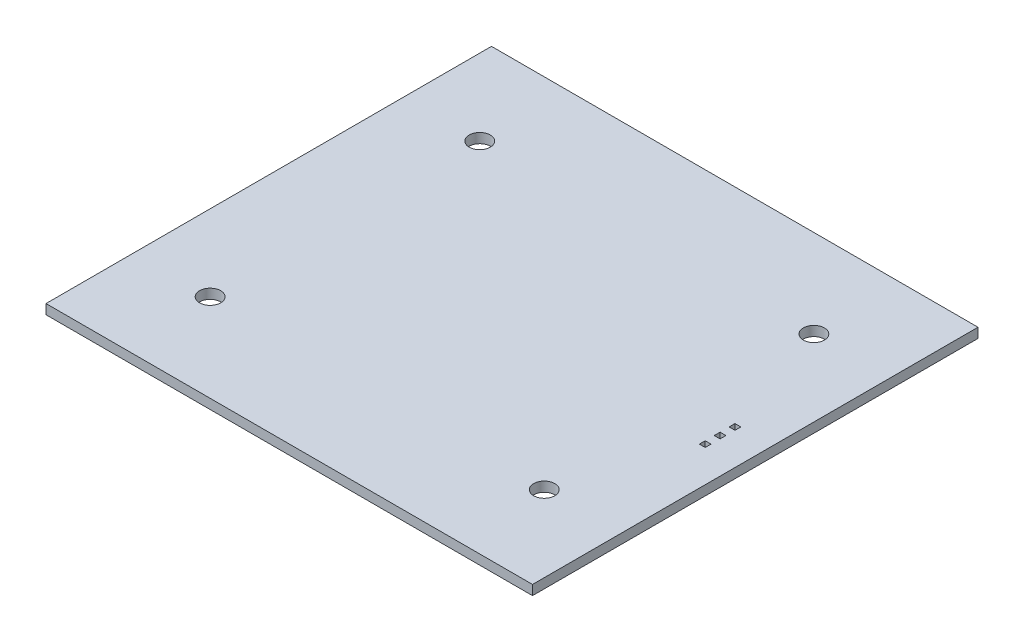
ISO-10303-21;
HEADER;
FILE_DESCRIPTION(('STEP AP214'),'2;1');
FILE_NAME('part.step','',(''),(''),'','','');
FILE_SCHEMA(('AUTOMOTIVE_DESIGN { 1 0 10303 214 1 1 1 1 }'));
ENDSEC;
DATA;
#1=APPLICATION_CONTEXT('core data for automotive mechanical design processes');
#2=APPLICATION_PROTOCOL_DEFINITION('international standard','automotive_design',2000,#1);
#3=PRODUCT_CONTEXT('',#1,'mechanical');
#4=PRODUCT('Part','Part','',(#3));
#5=PRODUCT_RELATED_PRODUCT_CATEGORY('part','',(#4));
#6=PRODUCT_DEFINITION_FORMATION('','',#4);
#7=PRODUCT_DEFINITION_CONTEXT('part definition',#1,'design');
#8=PRODUCT_DEFINITION('design','',#6,#7);
#9=PRODUCT_DEFINITION_SHAPE('','',#8);
#10=(LENGTH_UNIT() NAMED_UNIT(*) SI_UNIT(.MILLI.,.METRE.));
#11=(NAMED_UNIT(*) PLANE_ANGLE_UNIT() SI_UNIT($,.RADIAN.));
#12=(NAMED_UNIT(*) SI_UNIT($,.STERADIAN.) SOLID_ANGLE_UNIT());
#13=UNCERTAINTY_MEASURE_WITH_UNIT(LENGTH_MEASURE(1.E-05),#10,'distance_accuracy_value','');
#14=(GEOMETRIC_REPRESENTATION_CONTEXT(3) GLOBAL_UNCERTAINTY_ASSIGNED_CONTEXT((#13)) GLOBAL_UNIT_ASSIGNED_CONTEXT((#10,
#11,#12)) REPRESENTATION_CONTEXT('',''));
#15=CARTESIAN_POINT('',(0.,0.,0.));
#16=DIRECTION('',(0.,0.,1.));
#17=DIRECTION('',(1.,0.,0.));
#18=AXIS2_PLACEMENT_3D('',#15,#16,#17);
#19=CARTESIAN_POINT('',(0.,1.66,0.));
#20=DIRECTION('',(1.,0.,0.));
#21=DIRECTION('',(0.,0.,-1.));
#22=AXIS2_PLACEMENT_3D('',#19,#20,#21);
#23=PLANE('',#22);
#24=DIRECTION('',(0.,0.,1.));
#25=VECTOR('',#24,1.);
#26=CARTESIAN_POINT('',(0.,0.,0.));
#27=LINE('',#26,#25);
#28=CARTESIAN_POINT('',(0.,0.,-76.));
#29=VERTEX_POINT('',#28);
#30=CARTESIAN_POINT('',(0.,0.,0.));
#31=VERTEX_POINT('',#30);
#32=EDGE_CURVE('E241',#29,#31,#27,.T.);
#33=ORIENTED_EDGE('',*,*,#32,.T.);
#34=DIRECTION('',(0.,-1.,0.));
#35=VECTOR('',#34,1.);
#36=CARTESIAN_POINT('',(0.,1.66,0.));
#37=LINE('',#36,#35);
#38=CARTESIAN_POINT('',(0.,1.66,0.));
#39=VERTEX_POINT('',#38);
#40=EDGE_CURVE('E11',#39,#31,#37,.T.);
#41=ORIENTED_EDGE('',*,*,#40,.F.);
#42=DIRECTION('',(0.,0.,1.));
#43=VECTOR('',#42,1.);
#44=CARTESIAN_POINT('',(0.,1.66,0.));
#45=LINE('',#44,#43);
#46=CARTESIAN_POINT('',(0.,1.66,-76.));
#47=VERTEX_POINT('',#46);
#48=EDGE_CURVE('E248',#47,#39,#45,.T.);
#49=ORIENTED_EDGE('',*,*,#48,.F.);
#50=DIRECTION('',(0.,-1.,0.));
#51=VECTOR('',#50,1.);
#52=CARTESIAN_POINT('',(0.,1.66,-76.));
#53=LINE('',#52,#51);
#54=EDGE_CURVE('E258',#47,#29,#53,.T.);
#55=ORIENTED_EDGE('',*,*,#54,.T.);
#56=EDGE_LOOP('',(#33,#41,#49,#55));
#57=FACE_BOUND('',#56,.T.);
#58=ADVANCED_FACE('F32',(#57),#23,.F.);
#59=CARTESIAN_POINT('',(0.,1.66,0.));
#60=DIRECTION('',(0.,0.,-1.));
#61=DIRECTION('',(-1.,0.,0.));
#62=AXIS2_PLACEMENT_3D('',#59,#60,#61);
#63=PLANE('',#62);
#64=DIRECTION('',(1.,0.,0.));
#65=VECTOR('',#64,1.);
#66=CARTESIAN_POINT('',(0.,0.,0.));
#67=LINE('',#66,#65);
#68=CARTESIAN_POINT('',(83.,0.,0.));
#69=VERTEX_POINT('',#68);
#70=EDGE_CURVE('E261',#31,#69,#67,.T.);
#71=ORIENTED_EDGE('',*,*,#70,.T.);
#72=DIRECTION('',(0.,-1.,0.));
#73=VECTOR('',#72,1.);
#74=CARTESIAN_POINT('',(83.,1.66,0.));
#75=LINE('',#74,#73);
#76=CARTESIAN_POINT('',(83.,1.66,0.));
#77=VERTEX_POINT('',#76);
#78=EDGE_CURVE('E39',#77,#69,#75,.T.);
#79=ORIENTED_EDGE('',*,*,#78,.F.);
#80=DIRECTION('',(1.,0.,0.));
#81=VECTOR('',#80,1.);
#82=CARTESIAN_POINT('',(0.,1.66,0.));
#83=LINE('',#82,#81);
#84=EDGE_CURVE('E251',#39,#77,#83,.T.);
#85=ORIENTED_EDGE('',*,*,#84,.F.);
#86=ORIENTED_EDGE('',*,*,#40,.T.);
#87=EDGE_LOOP('',(#71,#79,#85,#86));
#88=FACE_BOUND('',#87,.T.);
#89=ADVANCED_FACE('F290',(#88),#63,.F.);
#90=CARTESIAN_POINT('',(83.,1.66,0.));
#91=DIRECTION('',(-1.,0.,0.));
#92=DIRECTION('',(0.,0.,1.));
#93=AXIS2_PLACEMENT_3D('',#90,#91,#92);
#94=PLANE('',#93);
#95=DIRECTION('',(0.,0.,-1.));
#96=VECTOR('',#95,1.);
#97=CARTESIAN_POINT('',(83.,0.,0.));
#98=LINE('',#97,#96);
#99=CARTESIAN_POINT('',(83.,0.,-76.));
#100=VERTEX_POINT('',#99);
#101=EDGE_CURVE('E263',#69,#100,#98,.T.);
#102=ORIENTED_EDGE('',*,*,#101,.T.);
#103=DIRECTION('',(0.,-1.,0.));
#104=VECTOR('',#103,1.);
#105=CARTESIAN_POINT('',(83.,1.66,-76.));
#106=LINE('',#105,#104);
#107=CARTESIAN_POINT('',(83.,1.66,-76.));
#108=VERTEX_POINT('',#107);
#109=EDGE_CURVE('E268',#108,#100,#106,.T.);
#110=ORIENTED_EDGE('',*,*,#109,.F.);
#111=DIRECTION('',(0.,0.,-1.));
#112=VECTOR('',#111,1.);
#113=CARTESIAN_POINT('',(83.,1.66,0.));
#114=LINE('',#113,#112);
#115=EDGE_CURVE('E254',#77,#108,#114,.T.);
#116=ORIENTED_EDGE('',*,*,#115,.F.);
#117=ORIENTED_EDGE('',*,*,#78,.T.);
#118=EDGE_LOOP('',(#102,#110,#116,#117));
#119=FACE_BOUND('',#118,.T.);
#120=ADVANCED_FACE('F275',(#119),#94,.F.);
#121=CARTESIAN_POINT('',(0.,1.66,-76.));
#122=DIRECTION('',(0.,0.,1.));
#123=DIRECTION('',(1.,0.,0.));
#124=AXIS2_PLACEMENT_3D('',#121,#122,#123);
#125=PLANE('',#124);
#126=DIRECTION('',(-1.,0.,0.));
#127=VECTOR('',#126,1.);
#128=CARTESIAN_POINT('',(0.,0.,-76.));
#129=LINE('',#128,#127);
#130=EDGE_CURVE('E252',#100,#29,#129,.T.);
#131=ORIENTED_EDGE('',*,*,#130,.T.);
#132=ORIENTED_EDGE('',*,*,#54,.F.);
#133=DIRECTION('',(-1.,0.,0.));
#134=VECTOR('',#133,1.);
#135=CARTESIAN_POINT('',(0.,1.66,-76.));
#136=LINE('',#135,#134);
#137=EDGE_CURVE('E256',#108,#47,#136,.T.);
#138=ORIENTED_EDGE('',*,*,#137,.F.);
#139=ORIENTED_EDGE('',*,*,#109,.T.);
#140=EDGE_LOOP('',(#131,#132,#138,#139));
#141=FACE_BOUND('',#140,.T.);
#142=ADVANCED_FACE('F283',(#141),#125,.F.);
#143=CARTESIAN_POINT('',(0.,1.66,0.));
#144=DIRECTION('',(0.,-1.,0.));
#145=DIRECTION('',(0.,0.,-1.));
#146=AXIS2_PLACEMENT_3D('',#143,#144,#145);
#147=PLANE('',#146);
#148=CARTESIAN_POINT('',(13.,1.66,-61.));
#149=DIRECTION('',(0.,1.,0.));
#150=DIRECTION('',(0.,0.,1.));
#151=AXIS2_PLACEMENT_3D('',#148,#149,#150);
#152=CIRCLE('',#151,1.8);
#153=CARTESIAN_POINT('',(13.,1.66,-59.2));
#154=VERTEX_POINT('',#153);
#155=EDGE_CURVE('E372',#154,#154,#152,.T.);
#156=ORIENTED_EDGE('',*,*,#155,.F.);
#157=EDGE_LOOP('',(#156));
#158=FACE_BOUND('',#157,.T.);
#159=CARTESIAN_POINT('',(70.,1.66,-61.));
#160=DIRECTION('',(0.,1.,0.));
#161=DIRECTION('',(0.,0.,1.));
#162=AXIS2_PLACEMENT_3D('',#159,#160,#161);
#163=CIRCLE('',#162,1.8);
#164=CARTESIAN_POINT('',(70.,1.66,-59.2));
#165=VERTEX_POINT('',#164);
#166=EDGE_CURVE('E374',#165,#165,#163,.T.);
#167=ORIENTED_EDGE('',*,*,#166,.F.);
#168=EDGE_LOOP('',(#167));
#169=FACE_BOUND('',#168,.T.);
#170=CARTESIAN_POINT('',(70.,1.66,-15.));
#171=DIRECTION('',(0.,1.,0.));
#172=DIRECTION('',(0.,0.,1.));
#173=AXIS2_PLACEMENT_3D('',#170,#171,#172);
#174=CIRCLE('',#173,1.8);
#175=CARTESIAN_POINT('',(70.,1.66,-13.2));
#176=VERTEX_POINT('',#175);
#177=EDGE_CURVE('E382',#176,#176,#174,.T.);
#178=ORIENTED_EDGE('',*,*,#177,.F.);
#179=EDGE_LOOP('',(#178));
#180=FACE_BOUND('',#179,.T.);
#181=CARTESIAN_POINT('',(13.,1.66,-15.));
#182=DIRECTION('',(0.,1.,0.));
#183=DIRECTION('',(0.,0.,1.));
#184=AXIS2_PLACEMENT_3D('',#181,#182,#183);
#185=CIRCLE('',#184,1.8);
#186=CARTESIAN_POINT('',(13.,1.66,-13.2));
#187=VERTEX_POINT('',#186);
#188=EDGE_CURVE('E387',#187,#187,#185,.T.);
#189=ORIENTED_EDGE('',*,*,#188,.F.);
#190=EDGE_LOOP('',(#189));
#191=FACE_BOUND('',#190,.T.);
#192=DIRECTION('',(-1.,0.,0.));
#193=VECTOR('',#192,1.);
#194=CARTESIAN_POINT('',(76.5,1.66,-35.96));
#195=LINE('',#194,#193);
#196=CARTESIAN_POINT('',(77.5,1.66,-35.96));
#197=VERTEX_POINT('',#196);
#198=CARTESIAN_POINT('',(76.5,1.66,-35.96));
#199=VERTEX_POINT('',#198);
#200=EDGE_CURVE('E174',#197,#199,#195,.T.);
#201=ORIENTED_EDGE('',*,*,#200,.F.);
#202=DIRECTION('',(0.,0.,-1.));
#203=VECTOR('',#202,1.);
#204=CARTESIAN_POINT('',(77.5,1.66,-34.96));
#205=LINE('',#204,#203);
#206=CARTESIAN_POINT('',(77.5,1.66,-34.96));
#207=VERTEX_POINT('',#206);
#208=EDGE_CURVE('E46',#207,#197,#205,.T.);
#209=ORIENTED_EDGE('',*,*,#208,.F.);
#210=DIRECTION('',(1.,0.,0.));
#211=VECTOR('',#210,1.);
#212=CARTESIAN_POINT('',(76.5,1.66,-34.96));
#213=LINE('',#212,#211);
#214=CARTESIAN_POINT('',(76.5,1.66,-34.96));
#215=VERTEX_POINT('',#214);
#216=EDGE_CURVE('E162',#215,#207,#213,.T.);
#217=ORIENTED_EDGE('',*,*,#216,.F.);
#218=DIRECTION('',(0.,0.,1.));
#219=VECTOR('',#218,1.);
#220=CARTESIAN_POINT('',(76.5,1.66,-34.96));
#221=LINE('',#220,#219);
#222=EDGE_CURVE('E165',#199,#215,#221,.T.);
#223=ORIENTED_EDGE('',*,*,#222,.F.);
#224=EDGE_LOOP('',(#201,#209,#217,#223));
#225=FACE_BOUND('',#224,.T.);
#226=DIRECTION('',(-1.,0.,0.));
#227=VECTOR('',#226,1.);
#228=CARTESIAN_POINT('',(76.5,1.66,-41.04));
#229=LINE('',#228,#227);
#230=CARTESIAN_POINT('',(77.5,1.66,-41.04));
#231=VERTEX_POINT('',#230);
#232=CARTESIAN_POINT('',(76.5,1.66,-41.04));
#233=VERTEX_POINT('',#232);
#234=EDGE_CURVE('E199',#231,#233,#229,.T.);
#235=ORIENTED_EDGE('',*,*,#234,.F.);
#236=DIRECTION('',(0.,0.,-1.));
#237=VECTOR('',#236,1.);
#238=CARTESIAN_POINT('',(77.5,1.66,-40.04));
#239=LINE('',#238,#237);
#240=CARTESIAN_POINT('',(77.5,1.66,-40.04));
#241=VERTEX_POINT('',#240);
#242=EDGE_CURVE('E180',#241,#231,#239,.T.);
#243=ORIENTED_EDGE('',*,*,#242,.F.);
#244=DIRECTION('',(1.,0.,0.));
#245=VECTOR('',#244,1.);
#246=CARTESIAN_POINT('',(76.5,1.66,-40.04));
#247=LINE('',#246,#245);
#248=CARTESIAN_POINT('',(76.5,1.66,-40.04));
#249=VERTEX_POINT('',#248);
#250=EDGE_CURVE('E188',#249,#241,#247,.T.);
#251=ORIENTED_EDGE('',*,*,#250,.F.);
#252=DIRECTION('',(0.,0.,1.));
#253=VECTOR('',#252,1.);
#254=CARTESIAN_POINT('',(76.5,1.66,-40.04));
#255=LINE('',#254,#253);
#256=EDGE_CURVE('E202',#233,#249,#255,.T.);
#257=ORIENTED_EDGE('',*,*,#256,.F.);
#258=EDGE_LOOP('',(#235,#243,#251,#257));
#259=FACE_BOUND('',#258,.T.);
#260=DIRECTION('',(-1.,0.,0.));
#261=VECTOR('',#260,1.);
#262=CARTESIAN_POINT('',(76.5,1.66,-38.5));
#263=LINE('',#262,#261);
#264=CARTESIAN_POINT('',(77.5,1.66,-38.5));
#265=VERTEX_POINT('',#264);
#266=CARTESIAN_POINT('',(76.5,1.66,-38.5));
#267=VERTEX_POINT('',#266);
#268=EDGE_CURVE('E231',#265,#267,#263,.T.);
#269=ORIENTED_EDGE('',*,*,#268,.F.);
#270=DIRECTION('',(0.,0.,-1.));
#271=VECTOR('',#270,1.);
#272=CARTESIAN_POINT('',(77.5,1.66,-37.5));
#273=LINE('',#272,#271);
#274=CARTESIAN_POINT('',(77.5,1.66,-37.5));
#275=VERTEX_POINT('',#274);
#276=EDGE_CURVE('E209',#275,#265,#273,.T.);
#277=ORIENTED_EDGE('',*,*,#276,.F.);
#278=DIRECTION('',(1.,0.,0.));
#279=VECTOR('',#278,1.);
#280=CARTESIAN_POINT('',(76.5,1.66,-37.5));
#281=LINE('',#280,#279);
#282=CARTESIAN_POINT('',(76.5,1.66,-37.5));
#283=VERTEX_POINT('',#282);
#284=EDGE_CURVE('E220',#283,#275,#281,.T.);
#285=ORIENTED_EDGE('',*,*,#284,.F.);
#286=DIRECTION('',(0.,0.,1.));
#287=VECTOR('',#286,1.);
#288=CARTESIAN_POINT('',(76.5,1.66,-37.5));
#289=LINE('',#288,#287);
#290=EDGE_CURVE('E234',#267,#283,#289,.T.);
#291=ORIENTED_EDGE('',*,*,#290,.F.);
#292=EDGE_LOOP('',(#269,#277,#285,#291));
#293=FACE_BOUND('',#292,.T.);
#294=ORIENTED_EDGE('',*,*,#48,.T.);
#295=ORIENTED_EDGE('',*,*,#84,.T.);
#296=ORIENTED_EDGE('',*,*,#115,.T.);
#297=ORIENTED_EDGE('',*,*,#137,.T.);
#298=EDGE_LOOP('',(#294,#295,#296,#297));
#299=FACE_BOUND('',#298,.T.);
#300=ADVANCED_FACE('F289',(#158,#169,#180,#191,#225,#259,#293,#299),#147,.F.);
#301=CARTESIAN_POINT('',(0.,0.,0.));
#302=DIRECTION('',(0.,-1.,0.));
#303=DIRECTION('',(0.,0.,-1.));
#304=AXIS2_PLACEMENT_3D('',#301,#302,#303);
#305=PLANE('',#304);
#306=CARTESIAN_POINT('',(13.,0.,-61.));
#307=DIRECTION('',(0.,1.,0.));
#308=DIRECTION('',(0.,0.,1.));
#309=AXIS2_PLACEMENT_3D('',#306,#307,#308);
#310=CIRCLE('',#309,1.8);
#311=CARTESIAN_POINT('',(13.,0.,-59.2));
#312=VERTEX_POINT('',#311);
#313=EDGE_CURVE('E369',#312,#312,#310,.T.);
#314=ORIENTED_EDGE('',*,*,#313,.T.);
#315=EDGE_LOOP('',(#314));
#316=FACE_BOUND('',#315,.T.);
#317=CARTESIAN_POINT('',(70.,0.,-61.));
#318=DIRECTION('',(0.,1.,0.));
#319=DIRECTION('',(0.,0.,1.));
#320=AXIS2_PLACEMENT_3D('',#317,#318,#319);
#321=CIRCLE('',#320,1.8);
#322=CARTESIAN_POINT('',(70.,0.,-59.2));
#323=VERTEX_POINT('',#322);
#324=EDGE_CURVE('E379',#323,#323,#321,.T.);
#325=ORIENTED_EDGE('',*,*,#324,.T.);
#326=EDGE_LOOP('',(#325));
#327=FACE_BOUND('',#326,.T.);
#328=CARTESIAN_POINT('',(70.,0.,-15.));
#329=DIRECTION('',(0.,1.,0.));
#330=DIRECTION('',(0.,0.,1.));
#331=AXIS2_PLACEMENT_3D('',#328,#329,#330);
#332=CIRCLE('',#331,1.8);
#333=CARTESIAN_POINT('',(70.,0.,-13.2));
#334=VERTEX_POINT('',#333);
#335=EDGE_CURVE('E385',#334,#334,#332,.T.);
#336=ORIENTED_EDGE('',*,*,#335,.T.);
#337=EDGE_LOOP('',(#336));
#338=FACE_BOUND('',#337,.T.);
#339=CARTESIAN_POINT('',(13.,0.,-15.));
#340=DIRECTION('',(0.,1.,0.));
#341=DIRECTION('',(0.,0.,1.));
#342=AXIS2_PLACEMENT_3D('',#339,#340,#341);
#343=CIRCLE('',#342,1.8);
#344=CARTESIAN_POINT('',(13.,0.,-13.2));
#345=VERTEX_POINT('',#344);
#346=EDGE_CURVE('E168',#345,#345,#343,.T.);
#347=ORIENTED_EDGE('',*,*,#346,.T.);
#348=EDGE_LOOP('',(#347));
#349=FACE_BOUND('',#348,.T.);
#350=DIRECTION('',(0.,0.,-1.));
#351=VECTOR('',#350,1.);
#352=CARTESIAN_POINT('',(77.5,0.,-34.96));
#353=LINE('',#352,#351);
#354=CARTESIAN_POINT('',(77.5,0.,-34.96));
#355=VERTEX_POINT('',#354);
#356=CARTESIAN_POINT('',(77.5,0.,-35.96));
#357=VERTEX_POINT('',#356);
#358=EDGE_CURVE('E146',#355,#357,#353,.T.);
#359=ORIENTED_EDGE('',*,*,#358,.T.);
#360=DIRECTION('',(-1.,0.,0.));
#361=VECTOR('',#360,1.);
#362=CARTESIAN_POINT('',(76.5,0.,-35.96));
#363=LINE('',#362,#361);
#364=CARTESIAN_POINT('',(76.5,0.,-35.96));
#365=VERTEX_POINT('',#364);
#366=EDGE_CURVE('E155',#357,#365,#363,.T.);
#367=ORIENTED_EDGE('',*,*,#366,.T.);
#368=DIRECTION('',(0.,0.,1.));
#369=VECTOR('',#368,1.);
#370=CARTESIAN_POINT('',(76.5,0.,-34.96));
#371=LINE('',#370,#369);
#372=CARTESIAN_POINT('',(76.5,0.,-34.96));
#373=VERTEX_POINT('',#372);
#374=EDGE_CURVE('E54',#365,#373,#371,.T.);
#375=ORIENTED_EDGE('',*,*,#374,.T.);
#376=DIRECTION('',(1.,0.,0.));
#377=VECTOR('',#376,1.);
#378=CARTESIAN_POINT('',(76.5,0.,-34.96));
#379=LINE('',#378,#377);
#380=EDGE_CURVE('E152',#373,#355,#379,.T.);
#381=ORIENTED_EDGE('',*,*,#380,.T.);
#382=EDGE_LOOP('',(#359,#367,#375,#381));
#383=FACE_BOUND('',#382,.T.);
#384=DIRECTION('',(0.,0.,-1.));
#385=VECTOR('',#384,1.);
#386=CARTESIAN_POINT('',(77.5,0.,-40.04));
#387=LINE('',#386,#385);
#388=CARTESIAN_POINT('',(77.5,0.,-40.04));
#389=VERTEX_POINT('',#388);
#390=CARTESIAN_POINT('',(77.5,0.,-41.04));
#391=VERTEX_POINT('',#390);
#392=EDGE_CURVE('E184',#389,#391,#387,.T.);
#393=ORIENTED_EDGE('',*,*,#392,.T.);
#394=DIRECTION('',(-1.,0.,0.));
#395=VECTOR('',#394,1.);
#396=CARTESIAN_POINT('',(76.5,0.,-41.04));
#397=LINE('',#396,#395);
#398=CARTESIAN_POINT('',(76.5,0.,-41.04));
#399=VERTEX_POINT('',#398);
#400=EDGE_CURVE('E187',#391,#399,#397,.T.);
#401=ORIENTED_EDGE('',*,*,#400,.T.);
#402=DIRECTION('',(0.,0.,1.));
#403=VECTOR('',#402,1.);
#404=CARTESIAN_POINT('',(76.5,0.,-40.04));
#405=LINE('',#404,#403);
#406=CARTESIAN_POINT('',(76.5,0.,-40.04));
#407=VERTEX_POINT('',#406);
#408=EDGE_CURVE('E191',#399,#407,#405,.T.);
#409=ORIENTED_EDGE('',*,*,#408,.T.);
#410=DIRECTION('',(1.,0.,0.));
#411=VECTOR('',#410,1.);
#412=CARTESIAN_POINT('',(76.5,0.,-40.04));
#413=LINE('',#412,#411);
#414=EDGE_CURVE('E194',#407,#389,#413,.T.);
#415=ORIENTED_EDGE('',*,*,#414,.T.);
#416=EDGE_LOOP('',(#393,#401,#409,#415));
#417=FACE_BOUND('',#416,.T.);
#418=DIRECTION('',(0.,0.,-1.));
#419=VECTOR('',#418,1.);
#420=CARTESIAN_POINT('',(77.5,0.,-37.5));
#421=LINE('',#420,#419);
#422=CARTESIAN_POINT('',(77.5,0.,-37.5));
#423=VERTEX_POINT('',#422);
#424=CARTESIAN_POINT('',(77.5,0.,-38.5));
#425=VERTEX_POINT('',#424);
#426=EDGE_CURVE('E216',#423,#425,#421,.T.);
#427=ORIENTED_EDGE('',*,*,#426,.T.);
#428=DIRECTION('',(-1.,0.,0.));
#429=VECTOR('',#428,1.);
#430=CARTESIAN_POINT('',(76.5,0.,-38.5));
#431=LINE('',#430,#429);
#432=CARTESIAN_POINT('',(76.5,0.,-38.5));
#433=VERTEX_POINT('',#432);
#434=EDGE_CURVE('E219',#425,#433,#431,.T.);
#435=ORIENTED_EDGE('',*,*,#434,.T.);
#436=DIRECTION('',(0.,0.,1.));
#437=VECTOR('',#436,1.);
#438=CARTESIAN_POINT('',(76.5,0.,-37.5));
#439=LINE('',#438,#437);
#440=CARTESIAN_POINT('',(76.5,0.,-37.5));
#441=VERTEX_POINT('',#440);
#442=EDGE_CURVE('E223',#433,#441,#439,.T.);
#443=ORIENTED_EDGE('',*,*,#442,.T.);
#444=DIRECTION('',(1.,0.,0.));
#445=VECTOR('',#444,1.);
#446=CARTESIAN_POINT('',(76.5,0.,-37.5));
#447=LINE('',#446,#445);
#448=EDGE_CURVE('E226',#441,#423,#447,.T.);
#449=ORIENTED_EDGE('',*,*,#448,.T.);
#450=EDGE_LOOP('',(#427,#435,#443,#449));
#451=FACE_BOUND('',#450,.T.);
#452=ORIENTED_EDGE('',*,*,#32,.F.);
#453=ORIENTED_EDGE('',*,*,#130,.F.);
#454=ORIENTED_EDGE('',*,*,#101,.F.);
#455=ORIENTED_EDGE('',*,*,#70,.F.);
#456=EDGE_LOOP('',(#452,#453,#454,#455));
#457=FACE_BOUND('',#456,.T.);
#458=ADVANCED_FACE('F159',(#316,#327,#338,#349,#383,#417,#451,#457),#305,.T.);
#459=CARTESIAN_POINT('',(77.5,0.,-37.5));
#460=DIRECTION('',(1.,0.,0.));
#461=DIRECTION('',(0.,0.,-1.));
#462=AXIS2_PLACEMENT_3D('',#459,#460,#461);
#463=PLANE('',#462);
#464=ORIENTED_EDGE('',*,*,#276,.T.);
#465=DIRECTION('',(0.,1.,0.));
#466=VECTOR('',#465,1.);
#467=CARTESIAN_POINT('',(77.5,0.,-38.5));
#468=LINE('',#467,#466);
#469=EDGE_CURVE('E229',#425,#265,#468,.T.);
#470=ORIENTED_EDGE('',*,*,#469,.F.);
#471=ORIENTED_EDGE('',*,*,#426,.F.);
#472=DIRECTION('',(0.,1.,0.));
#473=VECTOR('',#472,1.);
#474=CARTESIAN_POINT('',(77.5,0.,-37.5));
#475=LINE('',#474,#473);
#476=EDGE_CURVE('E239',#423,#275,#475,.T.);
#477=ORIENTED_EDGE('',*,*,#476,.T.);
#478=EDGE_LOOP('',(#464,#470,#471,#477));
#479=FACE_BOUND('',#478,.T.);
#480=ADVANCED_FACE('F302',(#479),#463,.F.);
#481=CARTESIAN_POINT('',(76.5,0.,-37.5));
#482=DIRECTION('',(0.,0.,1.));
#483=DIRECTION('',(1.,0.,0.));
#484=AXIS2_PLACEMENT_3D('',#481,#482,#483);
#485=PLANE('',#484);
#486=ORIENTED_EDGE('',*,*,#284,.T.);
#487=ORIENTED_EDGE('',*,*,#476,.F.);
#488=ORIENTED_EDGE('',*,*,#448,.F.);
#489=DIRECTION('',(0.,1.,0.));
#490=VECTOR('',#489,1.);
#491=CARTESIAN_POINT('',(76.5,0.,-37.5));
#492=LINE('',#491,#490);
#493=EDGE_CURVE('E242',#441,#283,#492,.T.);
#494=ORIENTED_EDGE('',*,*,#493,.T.);
#495=EDGE_LOOP('',(#486,#487,#488,#494));
#496=FACE_BOUND('',#495,.T.);
#497=ADVANCED_FACE('F309',(#496),#485,.F.);
#498=CARTESIAN_POINT('',(76.5,0.,-37.5));
#499=DIRECTION('',(-1.,0.,0.));
#500=DIRECTION('',(0.,0.,1.));
#501=AXIS2_PLACEMENT_3D('',#498,#499,#500);
#502=PLANE('',#501);
#503=ORIENTED_EDGE('',*,*,#290,.T.);
#504=ORIENTED_EDGE('',*,*,#493,.F.);
#505=ORIENTED_EDGE('',*,*,#442,.F.);
#506=DIRECTION('',(0.,1.,0.));
#507=VECTOR('',#506,1.);
#508=CARTESIAN_POINT('',(76.5,0.,-38.5));
#509=LINE('',#508,#507);
#510=EDGE_CURVE('E244',#433,#267,#509,.T.);
#511=ORIENTED_EDGE('',*,*,#510,.T.);
#512=EDGE_LOOP('',(#503,#504,#505,#511));
#513=FACE_BOUND('',#512,.T.);
#514=ADVANCED_FACE('F315',(#513),#502,.F.);
#515=CARTESIAN_POINT('',(76.5,0.,-38.5));
#516=DIRECTION('',(0.,0.,-1.));
#517=DIRECTION('',(-1.,0.,0.));
#518=AXIS2_PLACEMENT_3D('',#515,#516,#517);
#519=PLANE('',#518);
#520=ORIENTED_EDGE('',*,*,#268,.T.);
#521=ORIENTED_EDGE('',*,*,#510,.F.);
#522=ORIENTED_EDGE('',*,*,#434,.F.);
#523=ORIENTED_EDGE('',*,*,#469,.T.);
#524=EDGE_LOOP('',(#520,#521,#522,#523));
#525=FACE_BOUND('',#524,.T.);
#526=ADVANCED_FACE('F311',(#525),#519,.F.);
#527=CARTESIAN_POINT('',(77.5,0.,-40.04));
#528=DIRECTION('',(1.,0.,0.));
#529=DIRECTION('',(0.,0.,-1.));
#530=AXIS2_PLACEMENT_3D('',#527,#528,#529);
#531=PLANE('',#530);
#532=ORIENTED_EDGE('',*,*,#242,.T.);
#533=DIRECTION('',(0.,1.,0.));
#534=VECTOR('',#533,1.);
#535=CARTESIAN_POINT('',(77.5,0.,-41.04));
#536=LINE('',#535,#534);
#537=EDGE_CURVE('E197',#391,#231,#536,.T.);
#538=ORIENTED_EDGE('',*,*,#537,.F.);
#539=ORIENTED_EDGE('',*,*,#392,.F.);
#540=DIRECTION('',(0.,1.,0.));
#541=VECTOR('',#540,1.);
#542=CARTESIAN_POINT('',(77.5,0.,-40.04));
#543=LINE('',#542,#541);
#544=EDGE_CURVE('E207',#389,#241,#543,.T.);
#545=ORIENTED_EDGE('',*,*,#544,.T.);
#546=EDGE_LOOP('',(#532,#538,#539,#545));
#547=FACE_BOUND('',#546,.T.);
#548=ADVANCED_FACE('F314',(#547),#531,.F.);
#549=CARTESIAN_POINT('',(76.5,0.,-40.04));
#550=DIRECTION('',(0.,0.,1.));
#551=DIRECTION('',(1.,0.,0.));
#552=AXIS2_PLACEMENT_3D('',#549,#550,#551);
#553=PLANE('',#552);
#554=ORIENTED_EDGE('',*,*,#250,.T.);
#555=ORIENTED_EDGE('',*,*,#544,.F.);
#556=ORIENTED_EDGE('',*,*,#414,.F.);
#557=DIRECTION('',(0.,1.,0.));
#558=VECTOR('',#557,1.);
#559=CARTESIAN_POINT('',(76.5,0.,-40.04));
#560=LINE('',#559,#558);
#561=EDGE_CURVE('E210',#407,#249,#560,.T.);
#562=ORIENTED_EDGE('',*,*,#561,.T.);
#563=EDGE_LOOP('',(#554,#555,#556,#562));
#564=FACE_BOUND('',#563,.T.);
#565=ADVANCED_FACE('F325',(#564),#553,.F.);
#566=CARTESIAN_POINT('',(76.5,0.,-40.04));
#567=DIRECTION('',(-1.,0.,0.));
#568=DIRECTION('',(0.,0.,1.));
#569=AXIS2_PLACEMENT_3D('',#566,#567,#568);
#570=PLANE('',#569);
#571=ORIENTED_EDGE('',*,*,#256,.T.);
#572=ORIENTED_EDGE('',*,*,#561,.F.);
#573=ORIENTED_EDGE('',*,*,#408,.F.);
#574=DIRECTION('',(0.,1.,0.));
#575=VECTOR('',#574,1.);
#576=CARTESIAN_POINT('',(76.5,0.,-41.04));
#577=LINE('',#576,#575);
#578=EDGE_CURVE('E212',#399,#233,#577,.T.);
#579=ORIENTED_EDGE('',*,*,#578,.T.);
#580=EDGE_LOOP('',(#571,#572,#573,#579));
#581=FACE_BOUND('',#580,.T.);
#582=ADVANCED_FACE('F330',(#581),#570,.F.);
#583=CARTESIAN_POINT('',(76.5,0.,-41.04));
#584=DIRECTION('',(0.,0.,-1.));
#585=DIRECTION('',(-1.,0.,0.));
#586=AXIS2_PLACEMENT_3D('',#583,#584,#585);
#587=PLANE('',#586);
#588=ORIENTED_EDGE('',*,*,#234,.T.);
#589=ORIENTED_EDGE('',*,*,#578,.F.);
#590=ORIENTED_EDGE('',*,*,#400,.F.);
#591=ORIENTED_EDGE('',*,*,#537,.T.);
#592=EDGE_LOOP('',(#588,#589,#590,#591));
#593=FACE_BOUND('',#592,.T.);
#594=ADVANCED_FACE('F327',(#593),#587,.F.);
#595=CARTESIAN_POINT('',(77.5,0.,-34.96));
#596=DIRECTION('',(1.,0.,0.));
#597=DIRECTION('',(0.,0.,-1.));
#598=AXIS2_PLACEMENT_3D('',#595,#596,#597);
#599=PLANE('',#598);
#600=ORIENTED_EDGE('',*,*,#208,.T.);
#601=DIRECTION('',(0.,1.,0.));
#602=VECTOR('',#601,1.);
#603=CARTESIAN_POINT('',(77.5,0.,-35.96));
#604=LINE('',#603,#602);
#605=EDGE_CURVE('E142',#357,#197,#604,.T.);
#606=ORIENTED_EDGE('',*,*,#605,.F.);
#607=ORIENTED_EDGE('',*,*,#358,.F.);
#608=DIRECTION('',(0.,1.,0.));
#609=VECTOR('',#608,1.);
#610=CARTESIAN_POINT('',(77.5,0.,-34.96));
#611=LINE('',#610,#609);
#612=EDGE_CURVE('E178',#355,#207,#611,.T.);
#613=ORIENTED_EDGE('',*,*,#612,.T.);
#614=EDGE_LOOP('',(#600,#606,#607,#613));
#615=FACE_BOUND('',#614,.T.);
#616=ADVANCED_FACE('F144',(#615),#599,.F.);
#617=CARTESIAN_POINT('',(76.5,0.,-34.96));
#618=DIRECTION('',(0.,0.,1.));
#619=DIRECTION('',(1.,0.,0.));
#620=AXIS2_PLACEMENT_3D('',#617,#618,#619);
#621=PLANE('',#620);
#622=ORIENTED_EDGE('',*,*,#216,.T.);
#623=ORIENTED_EDGE('',*,*,#612,.F.);
#624=ORIENTED_EDGE('',*,*,#380,.F.);
#625=DIRECTION('',(0.,1.,0.));
#626=VECTOR('',#625,1.);
#627=CARTESIAN_POINT('',(76.5,0.,-34.96));
#628=LINE('',#627,#626);
#629=EDGE_CURVE('E181',#373,#215,#628,.T.);
#630=ORIENTED_EDGE('',*,*,#629,.T.);
#631=EDGE_LOOP('',(#622,#623,#624,#630));
#632=FACE_BOUND('',#631,.T.);
#633=ADVANCED_FACE('F340',(#632),#621,.F.);
#634=CARTESIAN_POINT('',(76.5,0.,-34.96));
#635=DIRECTION('',(-1.,0.,0.));
#636=DIRECTION('',(0.,0.,1.));
#637=AXIS2_PLACEMENT_3D('',#634,#635,#636);
#638=PLANE('',#637);
#639=ORIENTED_EDGE('',*,*,#222,.T.);
#640=ORIENTED_EDGE('',*,*,#629,.F.);
#641=ORIENTED_EDGE('',*,*,#374,.F.);
#642=DIRECTION('',(0.,1.,0.));
#643=VECTOR('',#642,1.);
#644=CARTESIAN_POINT('',(76.5,0.,-35.96));
#645=LINE('',#644,#643);
#646=EDGE_CURVE('E151',#365,#199,#645,.T.);
#647=ORIENTED_EDGE('',*,*,#646,.T.);
#648=EDGE_LOOP('',(#639,#640,#641,#647));
#649=FACE_BOUND('',#648,.T.);
#650=ADVANCED_FACE('F344',(#649),#638,.F.);
#651=CARTESIAN_POINT('',(76.5,0.,-35.96));
#652=DIRECTION('',(0.,0.,-1.));
#653=DIRECTION('',(-1.,0.,0.));
#654=AXIS2_PLACEMENT_3D('',#651,#652,#653);
#655=PLANE('',#654);
#656=ORIENTED_EDGE('',*,*,#200,.T.);
#657=ORIENTED_EDGE('',*,*,#646,.F.);
#658=ORIENTED_EDGE('',*,*,#366,.F.);
#659=ORIENTED_EDGE('',*,*,#605,.T.);
#660=EDGE_LOOP('',(#656,#657,#658,#659));
#661=FACE_BOUND('',#660,.T.);
#662=ADVANCED_FACE('F156',(#661),#655,.F.);
#663=CARTESIAN_POINT('',(13.,1.66,-15.));
#664=DIRECTION('',(0.,1.,0.));
#665=DIRECTION('',(0.,0.,1.));
#666=AXIS2_PLACEMENT_3D('',#663,#664,#665);
#667=CYLINDRICAL_SURFACE('',#666,1.8);
#668=ORIENTED_EDGE('',*,*,#346,.F.);
#669=EDGE_LOOP('',(#668));
#670=FACE_BOUND('',#669,.T.);
#671=ORIENTED_EDGE('',*,*,#188,.T.);
#672=EDGE_LOOP('',(#671));
#673=FACE_BOUND('',#672,.T.);
#674=ADVANCED_FACE('F343',(#670,#673),#667,.F.);
#675=CARTESIAN_POINT('',(70.,1.66,-15.));
#676=DIRECTION('',(0.,1.,0.));
#677=DIRECTION('',(0.,0.,1.));
#678=AXIS2_PLACEMENT_3D('',#675,#676,#677);
#679=CYLINDRICAL_SURFACE('',#678,1.8);
#680=ORIENTED_EDGE('',*,*,#335,.F.);
#681=EDGE_LOOP('',(#680));
#682=FACE_BOUND('',#681,.T.);
#683=ORIENTED_EDGE('',*,*,#177,.T.);
#684=EDGE_LOOP('',(#683));
#685=FACE_BOUND('',#684,.T.);
#686=ADVANCED_FACE('F352',(#682,#685),#679,.F.);
#687=CARTESIAN_POINT('',(70.,1.66,-61.));
#688=DIRECTION('',(0.,1.,0.));
#689=DIRECTION('',(0.,0.,1.));
#690=AXIS2_PLACEMENT_3D('',#687,#688,#689);
#691=CYLINDRICAL_SURFACE('',#690,1.8);
#692=ORIENTED_EDGE('',*,*,#324,.F.);
#693=EDGE_LOOP('',(#692));
#694=FACE_BOUND('',#693,.T.);
#695=ORIENTED_EDGE('',*,*,#166,.T.);
#696=EDGE_LOOP('',(#695));
#697=FACE_BOUND('',#696,.T.);
#698=ADVANCED_FACE('F356',(#694,#697),#691,.F.);
#699=CARTESIAN_POINT('',(13.,1.66,-61.));
#700=DIRECTION('',(0.,1.,0.));
#701=DIRECTION('',(0.,0.,1.));
#702=AXIS2_PLACEMENT_3D('',#699,#700,#701);
#703=CYLINDRICAL_SURFACE('',#702,1.8);
#704=ORIENTED_EDGE('',*,*,#313,.F.);
#705=EDGE_LOOP('',(#704));
#706=FACE_BOUND('',#705,.T.);
#707=ORIENTED_EDGE('',*,*,#155,.T.);
#708=EDGE_LOOP('',(#707));
#709=FACE_BOUND('',#708,.T.);
#710=ADVANCED_FACE('F360',(#706,#709),#703,.F.);
#711=CLOSED_SHELL('',(#58,#89,#120,#142,#300,#458,#480,#497,#514,#526,#548,#565,#582,#594,#616,
#633,#650,#662,#674,#686,#698,#710));
#712=MANIFOLD_SOLID_BREP('B2',#711);
#713=ADVANCED_BREP_SHAPE_REPRESENTATION('',(#18,#712),#14);
#714=SHAPE_DEFINITION_REPRESENTATION(#9,#713);
ENDSEC;
END-ISO-10303-21;
